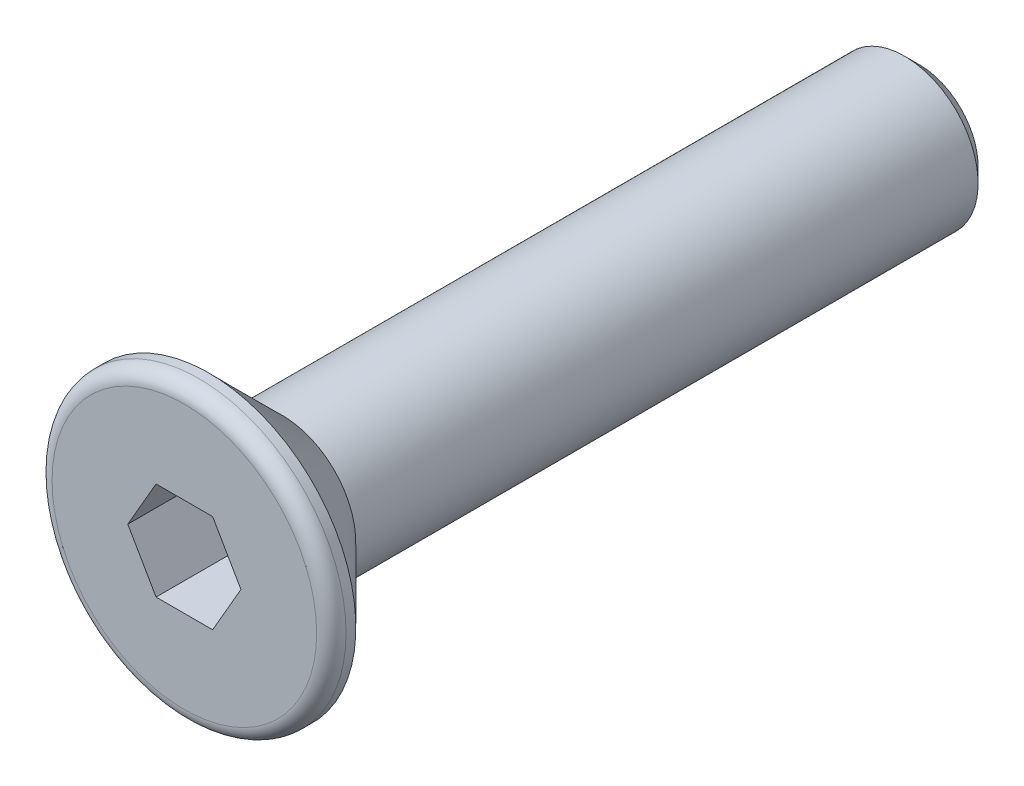
ISO-10303-21;
HEADER;
FILE_DESCRIPTION(('STEP AP214'),'2;1');
FILE_NAME('part.step','',(''),(''),'','','');
FILE_SCHEMA(('AUTOMOTIVE_DESIGN { 1 0 10303 214 1 1 1 1 }'));
ENDSEC;
DATA;
#1=APPLICATION_CONTEXT('core data for automotive mechanical design processes');
#2=APPLICATION_PROTOCOL_DEFINITION('international standard','automotive_design',2000,#1);
#3=PRODUCT_CONTEXT('',#1,'mechanical');
#4=PRODUCT('Part','Part','',(#3));
#5=PRODUCT_RELATED_PRODUCT_CATEGORY('part','',(#4));
#6=PRODUCT_DEFINITION_FORMATION('','',#4);
#7=PRODUCT_DEFINITION_CONTEXT('part definition',#1,'design');
#8=PRODUCT_DEFINITION('design','',#6,#7);
#9=PRODUCT_DEFINITION_SHAPE('','',#8);
#10=(LENGTH_UNIT() NAMED_UNIT(*) SI_UNIT(.MILLI.,.METRE.));
#11=(NAMED_UNIT(*) PLANE_ANGLE_UNIT() SI_UNIT($,.RADIAN.));
#12=(NAMED_UNIT(*) SI_UNIT($,.STERADIAN.) SOLID_ANGLE_UNIT());
#13=UNCERTAINTY_MEASURE_WITH_UNIT(LENGTH_MEASURE(1.E-05),#10,'distance_accuracy_value','');
#14=(GEOMETRIC_REPRESENTATION_CONTEXT(3) GLOBAL_UNCERTAINTY_ASSIGNED_CONTEXT((#13)) GLOBAL_UNIT_ASSIGNED_CONTEXT((#10,
#11,#12)) REPRESENTATION_CONTEXT('',''));
#15=CARTESIAN_POINT('',(0.,0.,0.));
#16=DIRECTION('',(0.,0.,1.));
#17=DIRECTION('',(1.,0.,0.));
#18=AXIS2_PLACEMENT_3D('',#15,#16,#17);
#19=CARTESIAN_POINT('',(0.,0.,7.5));
#20=DIRECTION('',(0.,0.,1.));
#21=DIRECTION('',(1.,0.,0.));
#22=AXIS2_PLACEMENT_3D('',#19,#20,#21);
#23=PLANE('',#22);
#24=CARTESIAN_POINT('',(0.,0.,7.5));
#25=DIRECTION('',(0.,0.,1.));
#26=DIRECTION('',(1.,0.,0.));
#27=AXIS2_PLACEMENT_3D('',#24,#25,#26);
#28=CIRCLE('',#27,2.7);
#29=CARTESIAN_POINT('',(2.7,0.,7.5));
#30=VERTEX_POINT('',#29);
#31=EDGE_CURVE('E11',#30,#30,#28,.T.);
#32=ORIENTED_EDGE('',*,*,#31,.T.);
#33=EDGE_LOOP('',(#32));
#34=FACE_BOUND('',#33,.T.);
#35=DIRECTION('',(0.5,0.866025403784439,0.));
#36=VECTOR('',#35,1.);
#37=CARTESIAN_POINT('',(0.577350269189626,-1.,7.5));
#38=LINE('',#37,#36);
#39=CARTESIAN_POINT('',(0.577350269189626,-1.,7.5));
#40=VERTEX_POINT('',#39);
#41=CARTESIAN_POINT('',(1.15470053837925,0.,7.5));
#42=VERTEX_POINT('',#41);
#43=EDGE_CURVE('E50',#40,#42,#38,.T.);
#44=ORIENTED_EDGE('',*,*,#43,.F.);
#45=DIRECTION('',(1.,0.,0.));
#46=VECTOR('',#45,1.);
#47=CARTESIAN_POINT('',(-0.577350269189626,-1.,7.5));
#48=LINE('',#47,#46);
#49=CARTESIAN_POINT('',(-0.577350269189626,-1.,7.5));
#50=VERTEX_POINT('',#49);
#51=EDGE_CURVE('E133',#50,#40,#48,.T.);
#52=ORIENTED_EDGE('',*,*,#51,.F.);
#53=DIRECTION('',(0.5,-0.866025403784438,0.));
#54=VECTOR('',#53,1.);
#55=CARTESIAN_POINT('',(-1.15470053837925,0.,7.5));
#56=LINE('',#55,#54);
#57=CARTESIAN_POINT('',(-1.15470053837925,0.,7.5));
#58=VERTEX_POINT('',#57);
#59=EDGE_CURVE('E131',#58,#50,#56,.T.);
#60=ORIENTED_EDGE('',*,*,#59,.F.);
#61=DIRECTION('',(-0.5,-0.866025403784439,0.));
#62=VECTOR('',#61,1.);
#63=CARTESIAN_POINT('',(-0.577350269189626,1.,7.5));
#64=LINE('',#63,#62);
#65=CARTESIAN_POINT('',(-0.577350269189626,1.,7.5));
#66=VERTEX_POINT('',#65);
#67=EDGE_CURVE('E98',#66,#58,#64,.T.);
#68=ORIENTED_EDGE('',*,*,#67,.F.);
#69=DIRECTION('',(-1.,0.,0.));
#70=VECTOR('',#69,1.);
#71=CARTESIAN_POINT('',(0.577350269189626,1.,7.5));
#72=LINE('',#71,#70);
#73=CARTESIAN_POINT('',(0.577350269189626,1.,7.5));
#74=VERTEX_POINT('',#73);
#75=EDGE_CURVE('E127',#74,#66,#72,.T.);
#76=ORIENTED_EDGE('',*,*,#75,.F.);
#77=DIRECTION('',(-0.5,0.866025403784438,0.));
#78=VECTOR('',#77,1.);
#79=CARTESIAN_POINT('',(1.15470053837925,0.,7.5));
#80=LINE('',#79,#78);
#81=EDGE_CURVE('E124',#42,#74,#80,.T.);
#82=ORIENTED_EDGE('',*,*,#81,.F.);
#83=EDGE_LOOP('',(#44,#52,#60,#68,#76,#82));
#84=FACE_BOUND('',#83,.T.);
#85=ADVANCED_FACE('F35',(#34,#84),#23,.T.);
#86=CARTESIAN_POINT('',(0.,0.,-7.5));
#87=DIRECTION('',(0.,0.,-1.));
#88=DIRECTION('',(-1.,0.,0.));
#89=AXIS2_PLACEMENT_3D('',#86,#87,#88);
#90=CYLINDRICAL_SURFACE('',#89,3.);
#91=CARTESIAN_POINT('',(0.,0.,7.2));
#92=DIRECTION('',(0.,0.,1.));
#93=DIRECTION('',(1.,0.,0.));
#94=AXIS2_PLACEMENT_3D('',#91,#92,#93);
#95=CIRCLE('',#94,3.);
#96=CARTESIAN_POINT('',(3.,0.,7.2));
#97=VERTEX_POINT('',#96);
#98=EDGE_CURVE('E43',#97,#97,#95,.F.);
#99=ORIENTED_EDGE('',*,*,#98,.T.);
#100=EDGE_LOOP('',(#99));
#101=FACE_BOUND('',#100,.T.);
#102=CARTESIAN_POINT('',(0.,0.,7.00000000000002));
#103=DIRECTION('',(0.,0.,-1.));
#104=DIRECTION('',(-1.,0.,0.));
#105=AXIS2_PLACEMENT_3D('',#102,#103,#104);
#106=CIRCLE('',#105,3.);
#107=CARTESIAN_POINT('',(-3.,0.,7.00000000000002));
#108=VERTEX_POINT('',#107);
#109=EDGE_CURVE('E151',#108,#108,#106,.T.);
#110=ORIENTED_EDGE('',*,*,#109,.F.);
#111=EDGE_LOOP('',(#110));
#112=FACE_BOUND('',#111,.T.);
#113=ADVANCED_FACE('F156',(#101,#112),#90,.T.);
#114=CARTESIAN_POINT('',(0.,0.,5.5));
#115=DIRECTION('',(0.,0.,1.));
#116=DIRECTION('',(1.,0.,0.));
#117=AXIS2_PLACEMENT_3D('',#114,#115,#116);
#118=CONICAL_SURFACE('',#117,1.5,0.785398163397443);
#119=ORIENTED_EDGE('',*,*,#109,.T.);
#120=EDGE_LOOP('',(#119));
#121=FACE_BOUND('',#120,.T.);
#122=CARTESIAN_POINT('',(0.,0.,5.5));
#123=DIRECTION('',(0.,0.,-1.));
#124=DIRECTION('',(-1.,0.,0.));
#125=AXIS2_PLACEMENT_3D('',#122,#123,#124);
#126=CIRCLE('',#125,1.5);
#127=CARTESIAN_POINT('',(-1.5,0.,5.5));
#128=VERTEX_POINT('',#127);
#129=EDGE_CURVE('E148',#128,#128,#126,.T.);
#130=ORIENTED_EDGE('',*,*,#129,.F.);
#131=EDGE_LOOP('',(#130));
#132=FACE_BOUND('',#131,.T.);
#133=ADVANCED_FACE('F172',(#121,#132),#118,.T.);
#134=CARTESIAN_POINT('',(0.,0.,-7.5));
#135=DIRECTION('',(0.,0.,-1.));
#136=DIRECTION('',(-1.,0.,0.));
#137=AXIS2_PLACEMENT_3D('',#134,#135,#136);
#138=CYLINDRICAL_SURFACE('',#137,1.5);
#139=ORIENTED_EDGE('',*,*,#129,.T.);
#140=EDGE_LOOP('',(#139));
#141=FACE_BOUND('',#140,.T.);
#142=CARTESIAN_POINT('',(0.,0.,-7.2));
#143=DIRECTION('',(0.,0.,-1.));
#144=DIRECTION('',(-1.,0.,0.));
#145=AXIS2_PLACEMENT_3D('',#142,#143,#144);
#146=CIRCLE('',#145,1.5);
#147=CARTESIAN_POINT('',(-1.5,0.,-7.2));
#148=VERTEX_POINT('',#147);
#149=EDGE_CURVE('E145',#148,#148,#146,.T.);
#150=ORIENTED_EDGE('',*,*,#149,.F.);
#151=EDGE_LOOP('',(#150));
#152=FACE_BOUND('',#151,.T.);
#153=ADVANCED_FACE('F178',(#141,#152),#138,.T.);
#154=CARTESIAN_POINT('',(0.,0.,-7.5));
#155=DIRECTION('',(0.,0.,1.));
#156=DIRECTION('',(1.,0.,0.));
#157=AXIS2_PLACEMENT_3D('',#154,#155,#156);
#158=CONICAL_SURFACE('',#157,1.2,0.785398163397443);
#159=ORIENTED_EDGE('',*,*,#149,.T.);
#160=EDGE_LOOP('',(#159));
#161=FACE_BOUND('',#160,.T.);
#162=CARTESIAN_POINT('',(0.,0.,-7.5));
#163=DIRECTION('',(0.,0.,-1.));
#164=DIRECTION('',(-1.,0.,0.));
#165=AXIS2_PLACEMENT_3D('',#162,#163,#164);
#166=CIRCLE('',#165,1.2);
#167=CARTESIAN_POINT('',(-1.2,0.,-7.5));
#168=VERTEX_POINT('',#167);
#169=EDGE_CURVE('E137',#168,#168,#166,.T.);
#170=ORIENTED_EDGE('',*,*,#169,.F.);
#171=EDGE_LOOP('',(#170));
#172=FACE_BOUND('',#171,.T.);
#173=ADVANCED_FACE('F182',(#161,#172),#158,.T.);
#174=CARTESIAN_POINT('',(0.,1.2,-7.5));
#175=DIRECTION('',(0.,0.,-1.));
#176=DIRECTION('',(-1.,0.,0.));
#177=AXIS2_PLACEMENT_3D('',#174,#175,#176);
#178=PLANE('',#177);
#179=ORIENTED_EDGE('',*,*,#169,.T.);
#180=EDGE_LOOP('',(#179));
#181=FACE_BOUND('',#180,.T.);
#182=ADVANCED_FACE('F186',(#181),#178,.T.);
#183=CARTESIAN_POINT('',(0.577350269189626,-1.,6.));
#184=DIRECTION('',(0.866025403784438,-0.5,0.));
#185=DIRECTION('',(0.5,0.866025403784439,0.));
#186=AXIS2_PLACEMENT_3D('',#183,#184,#185);
#187=PLANE('',#186);
#188=ORIENTED_EDGE('',*,*,#43,.T.);
#189=DIRECTION('',(0.,0.,1.));
#190=VECTOR('',#189,1.);
#191=CARTESIAN_POINT('',(1.15470053837925,0.,6.));
#192=LINE('',#191,#190);
#193=CARTESIAN_POINT('',(1.15470053837925,0.,6.));
#194=VERTEX_POINT('',#193);
#195=EDGE_CURVE('E80',#194,#42,#192,.T.);
#196=ORIENTED_EDGE('',*,*,#195,.F.);
#197=DIRECTION('',(0.5,0.866025403784439,0.));
#198=VECTOR('',#197,1.);
#199=CARTESIAN_POINT('',(0.577350269189626,-1.,6.));
#200=LINE('',#199,#198);
#201=CARTESIAN_POINT('',(0.577350269189626,-1.,6.));
#202=VERTEX_POINT('',#201);
#203=EDGE_CURVE('E135',#202,#194,#200,.T.);
#204=ORIENTED_EDGE('',*,*,#203,.F.);
#205=DIRECTION('',(0.,0.,1.));
#206=VECTOR('',#205,1.);
#207=CARTESIAN_POINT('',(0.577350269189626,-1.,6.));
#208=LINE('',#207,#206);
#209=EDGE_CURVE('E58',#202,#40,#208,.T.);
#210=ORIENTED_EDGE('',*,*,#209,.T.);
#211=EDGE_LOOP('',(#188,#196,#204,#210));
#212=FACE_BOUND('',#211,.T.);
#213=ADVANCED_FACE('F190',(#212),#187,.F.);
#214=CARTESIAN_POINT('',(-0.577350269189626,-1.,6.));
#215=DIRECTION('',(0.,-1.,0.));
#216=DIRECTION('',(1.,0.,0.));
#217=AXIS2_PLACEMENT_3D('',#214,#215,#216);
#218=PLANE('',#217);
#219=ORIENTED_EDGE('',*,*,#51,.T.);
#220=ORIENTED_EDGE('',*,*,#209,.F.);
#221=DIRECTION('',(1.,0.,0.));
#222=VECTOR('',#221,1.);
#223=CARTESIAN_POINT('',(-0.577350269189626,-1.,6.));
#224=LINE('',#223,#222);
#225=CARTESIAN_POINT('',(-0.577350269189626,-1.,6.));
#226=VERTEX_POINT('',#225);
#227=EDGE_CURVE('E110',#226,#202,#224,.T.);
#228=ORIENTED_EDGE('',*,*,#227,.F.);
#229=DIRECTION('',(0.,0.,1.));
#230=VECTOR('',#229,1.);
#231=CARTESIAN_POINT('',(-0.577350269189626,-1.,6.));
#232=LINE('',#231,#230);
#233=EDGE_CURVE('E102',#226,#50,#232,.T.);
#234=ORIENTED_EDGE('',*,*,#233,.T.);
#235=EDGE_LOOP('',(#219,#220,#228,#234));
#236=FACE_BOUND('',#235,.T.);
#237=ADVANCED_FACE('F194',(#236),#218,.F.);
#238=CARTESIAN_POINT('',(-1.15470053837925,0.,6.));
#239=DIRECTION('',(-0.866025403784439,-0.5,0.));
#240=DIRECTION('',(0.5,-0.866025403784439,0.));
#241=AXIS2_PLACEMENT_3D('',#238,#239,#240);
#242=PLANE('',#241);
#243=ORIENTED_EDGE('',*,*,#59,.T.);
#244=ORIENTED_EDGE('',*,*,#233,.F.);
#245=DIRECTION('',(0.5,-0.866025403784438,0.));
#246=VECTOR('',#245,1.);
#247=CARTESIAN_POINT('',(-1.15470053837925,0.,6.));
#248=LINE('',#247,#246);
#249=CARTESIAN_POINT('',(-1.15470053837925,0.,6.));
#250=VERTEX_POINT('',#249);
#251=EDGE_CURVE('E106',#250,#226,#248,.T.);
#252=ORIENTED_EDGE('',*,*,#251,.F.);
#253=DIRECTION('',(0.,0.,1.));
#254=VECTOR('',#253,1.);
#255=CARTESIAN_POINT('',(-1.15470053837925,0.,6.));
#256=LINE('',#255,#254);
#257=EDGE_CURVE('E91',#250,#58,#256,.T.);
#258=ORIENTED_EDGE('',*,*,#257,.T.);
#259=EDGE_LOOP('',(#243,#244,#252,#258));
#260=FACE_BOUND('',#259,.T.);
#261=ADVANCED_FACE('F107',(#260),#242,.F.);
#262=CARTESIAN_POINT('',(-0.577350269189626,1.,6.));
#263=DIRECTION('',(-0.866025403784439,0.5,0.));
#264=DIRECTION('',(-0.5,-0.866025403784439,0.));
#265=AXIS2_PLACEMENT_3D('',#262,#263,#264);
#266=PLANE('',#265);
#267=ORIENTED_EDGE('',*,*,#67,.T.);
#268=ORIENTED_EDGE('',*,*,#257,.F.);
#269=DIRECTION('',(-0.5,-0.866025403784439,0.));
#270=VECTOR('',#269,1.);
#271=CARTESIAN_POINT('',(-0.577350269189626,1.,6.));
#272=LINE('',#271,#270);
#273=CARTESIAN_POINT('',(-0.577350269189626,1.,6.));
#274=VERTEX_POINT('',#273);
#275=EDGE_CURVE('E95',#274,#250,#272,.T.);
#276=ORIENTED_EDGE('',*,*,#275,.F.);
#277=DIRECTION('',(0.,0.,1.));
#278=VECTOR('',#277,1.);
#279=CARTESIAN_POINT('',(-0.577350269189626,1.,6.));
#280=LINE('',#279,#278);
#281=EDGE_CURVE('E103',#274,#66,#280,.T.);
#282=ORIENTED_EDGE('',*,*,#281,.T.);
#283=EDGE_LOOP('',(#267,#268,#276,#282));
#284=FACE_BOUND('',#283,.T.);
#285=ADVANCED_FACE('F93',(#284),#266,.F.);
#286=CARTESIAN_POINT('',(0.577350269189626,1.,6.));
#287=DIRECTION('',(0.,1.,0.));
#288=DIRECTION('',(-1.,0.,0.));
#289=AXIS2_PLACEMENT_3D('',#286,#287,#288);
#290=PLANE('',#289);
#291=ORIENTED_EDGE('',*,*,#75,.T.);
#292=ORIENTED_EDGE('',*,*,#281,.F.);
#293=DIRECTION('',(-1.,0.,0.));
#294=VECTOR('',#293,1.);
#295=CARTESIAN_POINT('',(0.577350269189626,1.,6.));
#296=LINE('',#295,#294);
#297=CARTESIAN_POINT('',(0.577350269189626,1.,6.));
#298=VERTEX_POINT('',#297);
#299=EDGE_CURVE('E116',#298,#274,#296,.T.);
#300=ORIENTED_EDGE('',*,*,#299,.F.);
#301=DIRECTION('',(0.,0.,1.));
#302=VECTOR('',#301,1.);
#303=CARTESIAN_POINT('',(0.577350269189626,1.,6.));
#304=LINE('',#303,#302);
#305=EDGE_CURVE('E140',#298,#74,#304,.T.);
#306=ORIENTED_EDGE('',*,*,#305,.T.);
#307=EDGE_LOOP('',(#291,#292,#300,#306));
#308=FACE_BOUND('',#307,.T.);
#309=ADVANCED_FACE('F197',(#308),#290,.F.);
#310=CARTESIAN_POINT('',(1.15470053837925,0.,6.));
#311=DIRECTION('',(0.866025403784439,0.5,0.));
#312=DIRECTION('',(-0.5,0.866025403784439,0.));
#313=AXIS2_PLACEMENT_3D('',#310,#311,#312);
#314=PLANE('',#313);
#315=ORIENTED_EDGE('',*,*,#81,.T.);
#316=ORIENTED_EDGE('',*,*,#305,.F.);
#317=DIRECTION('',(-0.5,0.866025403784438,0.));
#318=VECTOR('',#317,1.);
#319=CARTESIAN_POINT('',(1.15470053837925,0.,6.));
#320=LINE('',#319,#318);
#321=EDGE_CURVE('E118',#194,#298,#320,.T.);
#322=ORIENTED_EDGE('',*,*,#321,.F.);
#323=ORIENTED_EDGE('',*,*,#195,.T.);
#324=EDGE_LOOP('',(#315,#316,#322,#323));
#325=FACE_BOUND('',#324,.T.);
#326=ADVANCED_FACE('F164',(#325),#314,.F.);
#327=CARTESIAN_POINT('',(0.,0.,6.));
#328=DIRECTION('',(0.,0.,1.));
#329=DIRECTION('',(1.,0.,0.));
#330=AXIS2_PLACEMENT_3D('',#327,#328,#329);
#331=PLANE('',#330);
#332=ORIENTED_EDGE('',*,*,#203,.T.);
#333=ORIENTED_EDGE('',*,*,#321,.T.);
#334=ORIENTED_EDGE('',*,*,#299,.T.);
#335=ORIENTED_EDGE('',*,*,#275,.T.);
#336=ORIENTED_EDGE('',*,*,#251,.T.);
#337=ORIENTED_EDGE('',*,*,#227,.T.);
#338=EDGE_LOOP('',(#332,#333,#334,#335,#336,#337));
#339=FACE_BOUND('',#338,.T.);
#340=ADVANCED_FACE('F113',(#339),#331,.T.);
#341=CARTESIAN_POINT('',(0.,0.,7.2));
#342=DIRECTION('',(0.,0.,1.));
#343=DIRECTION('',(1.,0.,0.));
#344=AXIS2_PLACEMENT_3D('',#341,#342,#343);
#345=TOROIDAL_SURFACE('',#344,2.7,0.3);
#346=ORIENTED_EDGE('',*,*,#31,.F.);
#347=EDGE_LOOP('',(#346));
#348=FACE_BOUND('',#347,.T.);
#349=ORIENTED_EDGE('',*,*,#98,.F.);
#350=EDGE_LOOP('',(#349));
#351=FACE_BOUND('',#350,.T.);
#352=ADVANCED_FACE('F37',(#348,#351),#345,.T.);
#353=CLOSED_SHELL('',(#85,#113,#133,#153,#173,#182,#213,#237,#261,#285,#309,#326,#340,#352));
#354=MANIFOLD_SOLID_BREP('B2',#353);
#355=ADVANCED_BREP_SHAPE_REPRESENTATION('',(#18,#354),#14);
#356=SHAPE_DEFINITION_REPRESENTATION(#9,#355);
ENDSEC;
END-ISO-10303-21;
